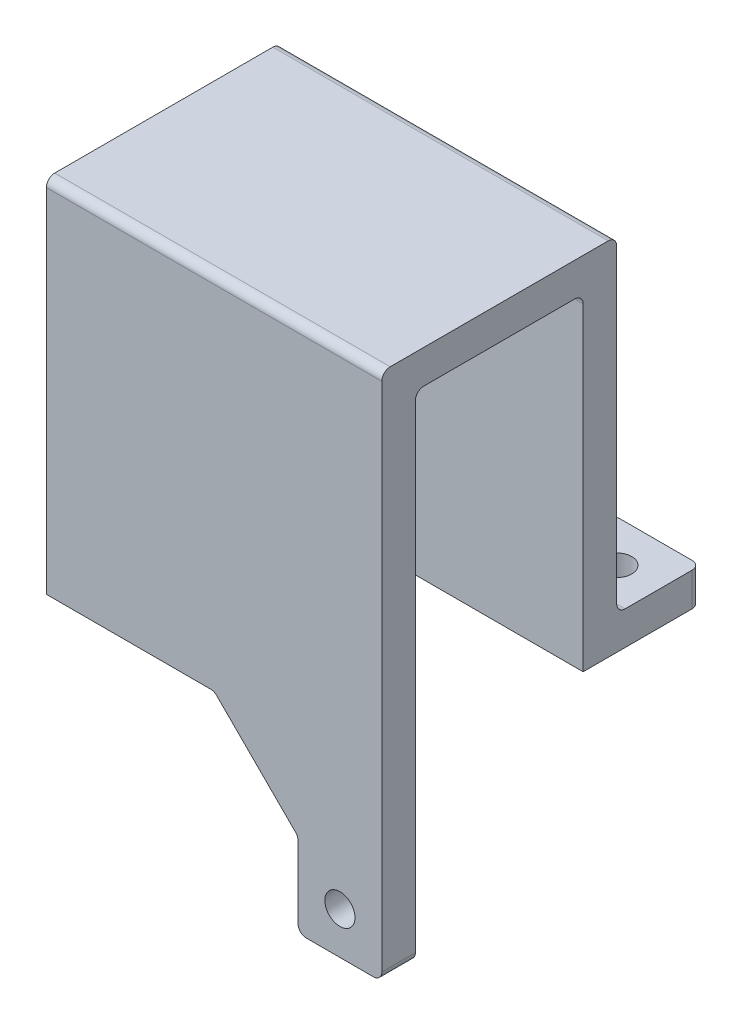
ISO-10303-21;
HEADER;
FILE_DESCRIPTION(('STEP AP214'),'2;1');
FILE_NAME('part.step','',(''),(''),'','','');
FILE_SCHEMA(('AUTOMOTIVE_DESIGN { 1 0 10303 214 1 1 1 1 }'));
ENDSEC;
DATA;
#1=APPLICATION_CONTEXT('core data for automotive mechanical design processes');
#2=APPLICATION_PROTOCOL_DEFINITION('international standard','automotive_design',2000,#1);
#3=PRODUCT_CONTEXT('',#1,'mechanical');
#4=PRODUCT('Part','Part','',(#3));
#5=PRODUCT_RELATED_PRODUCT_CATEGORY('part','',(#4));
#6=PRODUCT_DEFINITION_FORMATION('','',#4);
#7=PRODUCT_DEFINITION_CONTEXT('part definition',#1,'design');
#8=PRODUCT_DEFINITION('design','',#6,#7);
#9=PRODUCT_DEFINITION_SHAPE('','',#8);
#10=(LENGTH_UNIT() NAMED_UNIT(*) SI_UNIT(.MILLI.,.METRE.));
#11=(NAMED_UNIT(*) PLANE_ANGLE_UNIT() SI_UNIT($,.RADIAN.));
#12=(NAMED_UNIT(*) SI_UNIT($,.STERADIAN.) SOLID_ANGLE_UNIT());
#13=UNCERTAINTY_MEASURE_WITH_UNIT(LENGTH_MEASURE(1.E-05),#10,'distance_accuracy_value','');
#14=(GEOMETRIC_REPRESENTATION_CONTEXT(3) GLOBAL_UNCERTAINTY_ASSIGNED_CONTEXT((#13)) GLOBAL_UNIT_ASSIGNED_CONTEXT((#10,
#11,#12)) REPRESENTATION_CONTEXT('',''));
#15=CARTESIAN_POINT('',(0.,0.,0.));
#16=DIRECTION('',(0.,0.,1.));
#17=DIRECTION('',(1.,0.,0.));
#18=AXIS2_PLACEMENT_3D('',#15,#16,#17);
#19=CARTESIAN_POINT('',(0.,0.,0.));
#20=DIRECTION('',(0.,0.,1.));
#21=DIRECTION('',(1.,0.,0.));
#22=AXIS2_PLACEMENT_3D('',#19,#20,#21);
#23=PLANE('',#22);
#24=CARTESIAN_POINT('',(15.,-36.5,0.));
#25=DIRECTION('',(0.,0.,1.));
#26=DIRECTION('',(1.,0.,0.));
#27=AXIS2_PLACEMENT_3D('',#24,#25,#26);
#28=CIRCLE('',#27,1.80000000000001);
#29=CARTESIAN_POINT('',(16.8,-36.5,0.));
#30=VERTEX_POINT('',#29);
#31=EDGE_CURVE('E264',#30,#30,#28,.T.);
#32=ORIENTED_EDGE('',*,*,#31,.T.);
#33=EDGE_LOOP('',(#32));
#34=FACE_BOUND('',#33,.T.);
#35=DIRECTION('',(0.,1.,0.));
#36=VECTOR('',#35,1.);
#37=CARTESIAN_POINT('',(20.,0.,0.));
#38=LINE('',#37,#36);
#39=CARTESIAN_POINT('',(20.,-40.5,0.));
#40=VERTEX_POINT('',#39);
#41=CARTESIAN_POINT('',(20.,16.5,0.));
#42=VERTEX_POINT('',#41);
#43=EDGE_CURVE('E287',#40,#42,#38,.T.);
#44=ORIENTED_EDGE('',*,*,#43,.F.);
#45=CARTESIAN_POINT('',(19.,-40.5,0.));
#46=DIRECTION('',(0.,0.,1.));
#47=DIRECTION('',(1.,0.,0.));
#48=AXIS2_PLACEMENT_3D('',#45,#46,#47);
#49=CIRCLE('',#48,1.);
#50=CARTESIAN_POINT('',(19.,-41.5,0.));
#51=VERTEX_POINT('',#50);
#52=EDGE_CURVE('E344',#40,#51,#49,.F.);
#53=ORIENTED_EDGE('',*,*,#52,.T.);
#54=DIRECTION('',(-1.,0.,0.));
#55=VECTOR('',#54,1.);
#56=CARTESIAN_POINT('',(0.,-41.5,0.));
#57=LINE('',#56,#55);
#58=CARTESIAN_POINT('',(11.,-41.5,0.));
#59=VERTEX_POINT('',#58);
#60=EDGE_CURVE('E284',#51,#59,#57,.T.);
#61=ORIENTED_EDGE('',*,*,#60,.T.);
#62=CARTESIAN_POINT('',(11.,-40.5,0.));
#63=DIRECTION('',(0.,0.,1.));
#64=DIRECTION('',(1.,0.,0.));
#65=AXIS2_PLACEMENT_3D('',#62,#63,#64);
#66=CIRCLE('',#65,1.);
#67=CARTESIAN_POINT('',(10.,-40.5,0.));
#68=VERTEX_POINT('',#67);
#69=EDGE_CURVE('E342',#59,#68,#66,.F.);
#70=ORIENTED_EDGE('',*,*,#69,.T.);
#71=DIRECTION('',(0.,-1.,0.));
#72=VECTOR('',#71,1.);
#73=CARTESIAN_POINT('',(10.,0.,0.));
#74=LINE('',#73,#72);
#75=CARTESIAN_POINT('',(10.,-31.9142135623732,0.));
#76=VERTEX_POINT('',#75);
#77=EDGE_CURVE('E281',#76,#68,#74,.T.);
#78=ORIENTED_EDGE('',*,*,#77,.F.);
#79=CARTESIAN_POINT('',(9.00000000000001,-31.9142135623732,0.));
#80=DIRECTION('',(0.,0.,1.));
#81=DIRECTION('',(1.,0.,0.));
#82=AXIS2_PLACEMENT_3D('',#79,#80,#81);
#83=CIRCLE('',#82,1.);
#84=CARTESIAN_POINT('',(9.70710678118656,-31.2071067811866,0.));
#85=VERTEX_POINT('',#84);
#86=EDGE_CURVE('E390',#76,#85,#83,.T.);
#87=ORIENTED_EDGE('',*,*,#86,.T.);
#88=DIRECTION('',(0.707106781186545,-0.70710678118655,0.));
#89=VECTOR('',#88,1.);
#90=CARTESIAN_POINT('',(-10.75,-10.7499999999999,0.));
#91=LINE('',#90,#89);
#92=CARTESIAN_POINT('',(0.292893218813452,-21.7928932188135,0.));
#93=VERTEX_POINT('',#92);
#94=EDGE_CURVE('E301',#85,#93,#91,.F.);
#95=ORIENTED_EDGE('',*,*,#94,.T.);
#96=CARTESIAN_POINT('',(-0.414213562373096,-22.5,0.));
#97=DIRECTION('',(0.,0.,1.));
#98=DIRECTION('',(1.,0.,0.));
#99=AXIS2_PLACEMENT_3D('',#96,#97,#98);
#100=CIRCLE('',#99,1.);
#101=CARTESIAN_POINT('',(-0.414213562373096,-21.5,0.));
#102=VERTEX_POINT('',#101);
#103=EDGE_CURVE('E396',#93,#102,#100,.T.);
#104=ORIENTED_EDGE('',*,*,#103,.T.);
#105=DIRECTION('',(1.,0.,0.));
#106=VECTOR('',#105,1.);
#107=CARTESIAN_POINT('',(0.,-21.5,0.));
#108=LINE('',#107,#106);
#109=CARTESIAN_POINT('',(-20.,-21.5,0.));
#110=VERTEX_POINT('',#109);
#111=EDGE_CURVE('E259',#110,#102,#108,.T.);
#112=ORIENTED_EDGE('',*,*,#111,.F.);
#113=DIRECTION('',(0.,1.,0.));
#114=VECTOR('',#113,1.);
#115=CARTESIAN_POINT('',(-20.,0.,0.));
#116=LINE('',#115,#114);
#117=CARTESIAN_POINT('',(-20.,16.5,0.));
#118=VERTEX_POINT('',#117);
#119=EDGE_CURVE('E290',#110,#118,#116,.T.);
#120=ORIENTED_EDGE('',*,*,#119,.T.);
#121=DIRECTION('',(-1.,0.,0.));
#122=VECTOR('',#121,1.);
#123=CARTESIAN_POINT('',(20.,16.5,0.));
#124=LINE('',#123,#122);
#125=EDGE_CURVE('E340',#118,#42,#124,.F.);
#126=ORIENTED_EDGE('',*,*,#125,.T.);
#127=EDGE_LOOP('',(#44,#53,#61,#70,#78,#87,#95,#104,#112,#120,#126));
#128=FACE_BOUND('',#127,.T.);
#129=ADVANCED_FACE('F37',(#34,#128),#23,.F.);
#130=CARTESIAN_POINT('',(0.,-21.5,4.));
#131=DIRECTION('',(0.,1.,0.));
#132=DIRECTION('',(0.,0.,1.));
#133=AXIS2_PLACEMENT_3D('',#130,#131,#132);
#134=PLANE('',#133);
#135=ORIENTED_EDGE('',*,*,#111,.T.);
#136=DIRECTION('',(0.,0.,-1.));
#137=VECTOR('',#136,1.);
#138=CARTESIAN_POINT('',(-0.414213562373096,-21.5,4.));
#139=LINE('',#138,#137);
#140=CARTESIAN_POINT('',(-0.414213562373096,-21.5,4.));
#141=VERTEX_POINT('',#140);
#142=EDGE_CURVE('E360',#102,#141,#139,.F.);
#143=ORIENTED_EDGE('',*,*,#142,.T.);
#144=DIRECTION('',(1.,0.,0.));
#145=VECTOR('',#144,1.);
#146=CARTESIAN_POINT('',(0.,-21.5,4.));
#147=LINE('',#146,#145);
#148=CARTESIAN_POINT('',(-20.,-21.5,4.));
#149=VERTEX_POINT('',#148);
#150=EDGE_CURVE('E260',#149,#141,#147,.T.);
#151=ORIENTED_EDGE('',*,*,#150,.F.);
#152=DIRECTION('',(0.,0.,-1.));
#153=VECTOR('',#152,1.);
#154=CARTESIAN_POINT('',(-20.,-21.5,4.));
#155=LINE('',#154,#153);
#156=EDGE_CURVE('E278',#149,#110,#155,.T.);
#157=ORIENTED_EDGE('',*,*,#156,.T.);
#158=EDGE_LOOP('',(#135,#143,#151,#157));
#159=FACE_BOUND('',#158,.T.);
#160=ADVANCED_FACE('F443',(#159),#134,.F.);
#161=CARTESIAN_POINT('',(10.,0.,4.));
#162=DIRECTION('',(1.,0.,0.));
#163=DIRECTION('',(0.,1.,0.));
#164=AXIS2_PLACEMENT_3D('',#161,#162,#163);
#165=PLANE('',#164);
#166=ORIENTED_EDGE('',*,*,#77,.T.);
#167=DIRECTION('',(0.,0.,-1.));
#168=VECTOR('',#167,1.);
#169=CARTESIAN_POINT('',(10.,-40.5,4.));
#170=LINE('',#169,#168);
#171=CARTESIAN_POINT('',(10.,-40.5,4.));
#172=VERTEX_POINT('',#171);
#173=EDGE_CURVE('E354',#68,#172,#170,.F.);
#174=ORIENTED_EDGE('',*,*,#173,.T.);
#175=DIRECTION('',(0.,-1.,0.));
#176=VECTOR('',#175,1.);
#177=CARTESIAN_POINT('',(10.,0.,4.));
#178=LINE('',#177,#176);
#179=CARTESIAN_POINT('',(10.,-31.9142135623732,4.));
#180=VERTEX_POINT('',#179);
#181=EDGE_CURVE('E263',#180,#172,#178,.T.);
#182=ORIENTED_EDGE('',*,*,#181,.F.);
#183=DIRECTION('',(0.,0.,1.));
#184=VECTOR('',#183,1.);
#185=CARTESIAN_POINT('',(10.,-31.9142135623732,0.));
#186=LINE('',#185,#184);
#187=EDGE_CURVE('E351',#180,#76,#186,.F.);
#188=ORIENTED_EDGE('',*,*,#187,.T.);
#189=EDGE_LOOP('',(#166,#174,#182,#188));
#190=FACE_BOUND('',#189,.T.);
#191=ADVANCED_FACE('F449',(#190),#165,.F.);
#192=CARTESIAN_POINT('',(0.,-41.5,4.));
#193=DIRECTION('',(0.,-1.,0.));
#194=DIRECTION('',(1.,0.,0.));
#195=AXIS2_PLACEMENT_3D('',#192,#193,#194);
#196=PLANE('',#195);
#197=ORIENTED_EDGE('',*,*,#60,.F.);
#198=DIRECTION('',(0.,0.,-1.));
#199=VECTOR('',#198,1.);
#200=CARTESIAN_POINT('',(19.,-41.5,4.));
#201=LINE('',#200,#199);
#202=CARTESIAN_POINT('',(19.,-41.5,4.));
#203=VERTEX_POINT('',#202);
#204=EDGE_CURVE('E349',#51,#203,#201,.F.);
#205=ORIENTED_EDGE('',*,*,#204,.T.);
#206=DIRECTION('',(-1.,0.,0.));
#207=VECTOR('',#206,1.);
#208=CARTESIAN_POINT('',(0.,-41.5,4.));
#209=LINE('',#208,#207);
#210=CARTESIAN_POINT('',(11.,-41.5,4.));
#211=VERTEX_POINT('',#210);
#212=EDGE_CURVE('E267',#203,#211,#209,.T.);
#213=ORIENTED_EDGE('',*,*,#212,.T.);
#214=DIRECTION('',(0.,0.,-1.));
#215=VECTOR('',#214,1.);
#216=CARTESIAN_POINT('',(11.,-41.5,0.));
#217=LINE('',#216,#215);
#218=EDGE_CURVE('E346',#211,#59,#217,.T.);
#219=ORIENTED_EDGE('',*,*,#218,.T.);
#220=EDGE_LOOP('',(#197,#205,#213,#219));
#221=FACE_BOUND('',#220,.T.);
#222=ADVANCED_FACE('F466',(#221),#196,.T.);
#223=CARTESIAN_POINT('',(20.,0.,4.));
#224=DIRECTION('',(-1.,0.,0.));
#225=DIRECTION('',(0.,0.,1.));
#226=AXIS2_PLACEMENT_3D('',#223,#224,#225);
#227=PLANE('',#226);
#228=DIRECTION('',(0.,0.,-1.));
#229=VECTOR('',#228,1.);
#230=CARTESIAN_POINT('',(20.,21.5,4.));
#231=LINE('',#230,#229);
#232=CARTESIAN_POINT('',(20.,21.5,3.));
#233=VERTEX_POINT('',#232);
#234=CARTESIAN_POINT('',(20.,21.5,-23.));
#235=VERTEX_POINT('',#234);
#236=EDGE_CURVE('E298',#233,#235,#231,.T.);
#237=ORIENTED_EDGE('',*,*,#236,.F.);
#238=CARTESIAN_POINT('',(20.,20.5,3.));
#239=DIRECTION('',(-1.,0.,0.));
#240=DIRECTION('',(0.,0.,1.));
#241=AXIS2_PLACEMENT_3D('',#238,#239,#240);
#242=CIRCLE('',#241,1.);
#243=CARTESIAN_POINT('',(20.,20.5,4.));
#244=VERTEX_POINT('',#243);
#245=EDGE_CURVE('E324',#233,#244,#242,.F.);
#246=ORIENTED_EDGE('',*,*,#245,.T.);
#247=DIRECTION('',(0.,1.,0.));
#248=VECTOR('',#247,1.);
#249=CARTESIAN_POINT('',(20.,0.,4.));
#250=LINE('',#249,#248);
#251=CARTESIAN_POINT('',(20.,-40.5,4.));
#252=VERTEX_POINT('',#251);
#253=EDGE_CURVE('E270',#252,#244,#250,.T.);
#254=ORIENTED_EDGE('',*,*,#253,.F.);
#255=DIRECTION('',(0.,0.,-1.));
#256=VECTOR('',#255,1.);
#257=CARTESIAN_POINT('',(20.,-40.5,0.));
#258=LINE('',#257,#256);
#259=EDGE_CURVE('E319',#252,#40,#258,.T.);
#260=ORIENTED_EDGE('',*,*,#259,.T.);
#261=ORIENTED_EDGE('',*,*,#43,.T.);
#262=CARTESIAN_POINT('',(20.,16.5,-1.));
#263=DIRECTION('',(-1.,0.,0.));
#264=DIRECTION('',(0.,0.,1.));
#265=AXIS2_PLACEMENT_3D('',#262,#263,#264);
#266=CIRCLE('',#265,1.);
#267=CARTESIAN_POINT('',(20.,17.5,-1.));
#268=VERTEX_POINT('',#267);
#269=EDGE_CURVE('E11',#42,#268,#266,.T.);
#270=ORIENTED_EDGE('',*,*,#269,.T.);
#271=DIRECTION('',(0.,0.,1.));
#272=VECTOR('',#271,1.);
#273=CARTESIAN_POINT('',(20.,17.5,-20.));
#274=LINE('',#273,#272);
#275=CARTESIAN_POINT('',(20.,17.5,-19.));
#276=VERTEX_POINT('',#275);
#277=EDGE_CURVE('E256',#276,#268,#274,.T.);
#278=ORIENTED_EDGE('',*,*,#277,.F.);
#279=CARTESIAN_POINT('',(20.,16.5,-19.));
#280=DIRECTION('',(-1.,0.,0.));
#281=DIRECTION('',(0.,0.,1.));
#282=AXIS2_PLACEMENT_3D('',#279,#280,#281);
#283=CIRCLE('',#282,1.);
#284=CARTESIAN_POINT('',(20.,16.5,-20.));
#285=VERTEX_POINT('',#284);
#286=EDGE_CURVE('E405',#276,#285,#283,.T.);
#287=ORIENTED_EDGE('',*,*,#286,.T.);
#288=DIRECTION('',(0.,-1.,0.));
#289=VECTOR('',#288,1.);
#290=CARTESIAN_POINT('',(20.,-21.5,-20.));
#291=LINE('',#290,#289);
#292=CARTESIAN_POINT('',(20.,-21.5,-20.));
#293=VERTEX_POINT('',#292);
#294=EDGE_CURVE('E242',#285,#293,#291,.T.);
#295=ORIENTED_EDGE('',*,*,#294,.T.);
#296=DIRECTION('',(0.,0.,1.));
#297=VECTOR('',#296,1.);
#298=CARTESIAN_POINT('',(20.,-21.5,-24.));
#299=LINE('',#298,#297);
#300=CARTESIAN_POINT('',(20.,-21.5,-33.));
#301=VERTEX_POINT('',#300);
#302=EDGE_CURVE('E232',#301,#293,#299,.T.);
#303=ORIENTED_EDGE('',*,*,#302,.F.);
#304=DIRECTION('',(0.,-1.,0.));
#305=VECTOR('',#304,1.);
#306=CARTESIAN_POINT('',(20.,0.,-33.));
#307=LINE('',#306,#305);
#308=CARTESIAN_POINT('',(20.,-17.5,-33.));
#309=VERTEX_POINT('',#308);
#310=EDGE_CURVE('E317',#301,#309,#307,.F.);
#311=ORIENTED_EDGE('',*,*,#310,.T.);
#312=DIRECTION('',(0.,0.,1.));
#313=VECTOR('',#312,1.);
#314=CARTESIAN_POINT('',(20.,-17.5,-34.));
#315=LINE('',#314,#313);
#316=CARTESIAN_POINT('',(20.,-17.5,-25.));
#317=VERTEX_POINT('',#316);
#318=EDGE_CURVE('E245',#309,#317,#315,.T.);
#319=ORIENTED_EDGE('',*,*,#318,.T.);
#320=CARTESIAN_POINT('',(20.,-16.5,-25.));
#321=DIRECTION('',(-1.,0.,0.));
#322=DIRECTION('',(0.,0.,1.));
#323=AXIS2_PLACEMENT_3D('',#320,#321,#322);
#324=CIRCLE('',#323,1.);
#325=CARTESIAN_POINT('',(20.,-16.5,-24.));
#326=VERTEX_POINT('',#325);
#327=EDGE_CURVE('E400',#317,#326,#324,.T.);
#328=ORIENTED_EDGE('',*,*,#327,.T.);
#329=DIRECTION('',(0.,-1.,0.));
#330=VECTOR('',#329,1.);
#331=CARTESIAN_POINT('',(20.,-21.5,-24.));
#332=LINE('',#331,#330);
#333=CARTESIAN_POINT('',(20.,20.5,-24.));
#334=VERTEX_POINT('',#333);
#335=EDGE_CURVE('E222',#334,#326,#332,.T.);
#336=ORIENTED_EDGE('',*,*,#335,.F.);
#337=CARTESIAN_POINT('',(20.,20.5,-23.));
#338=DIRECTION('',(-1.,0.,0.));
#339=DIRECTION('',(0.,0.,1.));
#340=AXIS2_PLACEMENT_3D('',#337,#338,#339);
#341=CIRCLE('',#340,1.);
#342=EDGE_CURVE('E322',#334,#235,#341,.F.);
#343=ORIENTED_EDGE('',*,*,#342,.T.);
#344=EDGE_LOOP('',(#237,#246,#254,#260,#261,#270,#278,#287,#295,#303,#311,#319,#328,#336,#343));
#345=FACE_BOUND('',#344,.T.);
#346=ADVANCED_FACE('F419',(#345),#227,.F.);
#347=CARTESIAN_POINT('',(0.,21.5,4.));
#348=DIRECTION('',(0.,1.,0.));
#349=DIRECTION('',(0.,0.,1.));
#350=AXIS2_PLACEMENT_3D('',#347,#348,#349);
#351=PLANE('',#350);
#352=DIRECTION('',(0.,0.,-1.));
#353=VECTOR('',#352,1.);
#354=CARTESIAN_POINT('',(-20.,21.5,4.));
#355=LINE('',#354,#353);
#356=CARTESIAN_POINT('',(-20.,21.5,3.));
#357=VERTEX_POINT('',#356);
#358=CARTESIAN_POINT('',(-20.,21.5,-23.));
#359=VERTEX_POINT('',#358);
#360=EDGE_CURVE('E296',#357,#359,#355,.T.);
#361=ORIENTED_EDGE('',*,*,#360,.F.);
#362=DIRECTION('',(1.,0.,0.));
#363=VECTOR('',#362,1.);
#364=CARTESIAN_POINT('',(0.,21.5,3.));
#365=LINE('',#364,#363);
#366=EDGE_CURVE('E314',#357,#233,#365,.T.);
#367=ORIENTED_EDGE('',*,*,#366,.T.);
#368=ORIENTED_EDGE('',*,*,#236,.T.);
#369=DIRECTION('',(1.,0.,0.));
#370=VECTOR('',#369,1.);
#371=CARTESIAN_POINT('',(0.,21.5,-23.));
#372=LINE('',#371,#370);
#373=EDGE_CURVE('E312',#235,#359,#372,.F.);
#374=ORIENTED_EDGE('',*,*,#373,.T.);
#375=EDGE_LOOP('',(#361,#367,#368,#374));
#376=FACE_BOUND('',#375,.T.);
#377=ADVANCED_FACE('F460',(#376),#351,.T.);
#378=CARTESIAN_POINT('',(-20.,0.,4.));
#379=DIRECTION('',(-1.,0.,0.));
#380=DIRECTION('',(0.,0.,1.));
#381=AXIS2_PLACEMENT_3D('',#378,#379,#380);
#382=PLANE('',#381);
#383=DIRECTION('',(0.,1.,0.));
#384=VECTOR('',#383,1.);
#385=CARTESIAN_POINT('',(-20.,0.,4.));
#386=LINE('',#385,#384);
#387=CARTESIAN_POINT('',(-20.,20.5,4.));
#388=VERTEX_POINT('',#387);
#389=EDGE_CURVE('E273',#149,#388,#386,.T.);
#390=ORIENTED_EDGE('',*,*,#389,.T.);
#391=CARTESIAN_POINT('',(-20.,20.5,3.));
#392=DIRECTION('',(-1.,0.,0.));
#393=DIRECTION('',(0.,0.,1.));
#394=AXIS2_PLACEMENT_3D('',#391,#392,#393);
#395=CIRCLE('',#394,1.);
#396=EDGE_CURVE('E333',#388,#357,#395,.T.);
#397=ORIENTED_EDGE('',*,*,#396,.T.);
#398=ORIENTED_EDGE('',*,*,#360,.T.);
#399=CARTESIAN_POINT('',(-20.,20.5,-23.));
#400=DIRECTION('',(-1.,0.,0.));
#401=DIRECTION('',(0.,0.,1.));
#402=AXIS2_PLACEMENT_3D('',#399,#400,#401);
#403=CIRCLE('',#402,1.);
#404=CARTESIAN_POINT('',(-20.,20.5,-24.));
#405=VERTEX_POINT('',#404);
#406=EDGE_CURVE('E238',#359,#405,#403,.T.);
#407=ORIENTED_EDGE('',*,*,#406,.T.);
#408=DIRECTION('',(0.,1.,0.));
#409=VECTOR('',#408,1.);
#410=CARTESIAN_POINT('',(-20.,-21.5,-24.));
#411=LINE('',#410,#409);
#412=CARTESIAN_POINT('',(-20.,-21.5,-24.));
#413=VERTEX_POINT('',#412);
#414=EDGE_CURVE('E216',#413,#405,#411,.T.);
#415=ORIENTED_EDGE('',*,*,#414,.F.);
#416=DIRECTION('',(0.,0.,1.));
#417=VECTOR('',#416,1.);
#418=CARTESIAN_POINT('',(-20.,-21.5,-24.));
#419=LINE('',#418,#417);
#420=CARTESIAN_POINT('',(-20.,-21.5,-20.));
#421=VERTEX_POINT('',#420);
#422=EDGE_CURVE('E221',#413,#421,#419,.T.);
#423=ORIENTED_EDGE('',*,*,#422,.T.);
#424=DIRECTION('',(0.,1.,0.));
#425=VECTOR('',#424,1.);
#426=CARTESIAN_POINT('',(-20.,-21.5,-20.));
#427=LINE('',#426,#425);
#428=CARTESIAN_POINT('',(-20.,16.5,-20.));
#429=VERTEX_POINT('',#428);
#430=EDGE_CURVE('E248',#421,#429,#427,.T.);
#431=ORIENTED_EDGE('',*,*,#430,.T.);
#432=CARTESIAN_POINT('',(-20.,16.5,-19.));
#433=DIRECTION('',(-1.,0.,0.));
#434=DIRECTION('',(0.,0.,1.));
#435=AXIS2_PLACEMENT_3D('',#432,#433,#434);
#436=CIRCLE('',#435,1.);
#437=CARTESIAN_POINT('',(-20.,17.5,-19.));
#438=VERTEX_POINT('',#437);
#439=EDGE_CURVE('E403',#429,#438,#436,.F.);
#440=ORIENTED_EDGE('',*,*,#439,.T.);
#441=DIRECTION('',(0.,0.,1.));
#442=VECTOR('',#441,1.);
#443=CARTESIAN_POINT('',(-20.,17.5,-20.));
#444=LINE('',#443,#442);
#445=CARTESIAN_POINT('',(-20.,17.5,-1.));
#446=VERTEX_POINT('',#445);
#447=EDGE_CURVE('E253',#438,#446,#444,.T.);
#448=ORIENTED_EDGE('',*,*,#447,.T.);
#449=CARTESIAN_POINT('',(-20.,16.5,-1.));
#450=DIRECTION('',(-1.,0.,0.));
#451=DIRECTION('',(0.,0.,1.));
#452=AXIS2_PLACEMENT_3D('',#449,#450,#451);
#453=CIRCLE('',#452,1.);
#454=EDGE_CURVE('E46',#446,#118,#453,.F.);
#455=ORIENTED_EDGE('',*,*,#454,.T.);
#456=ORIENTED_EDGE('',*,*,#119,.F.);
#457=ORIENTED_EDGE('',*,*,#156,.F.);
#458=EDGE_LOOP('',(#390,#397,#398,#407,#415,#423,#431,#440,#448,#455,#456,#457));
#459=FACE_BOUND('',#458,.T.);
#460=ADVANCED_FACE('F235',(#459),#382,.T.);
#461=CARTESIAN_POINT('',(15.,-36.5,4.));
#462=DIRECTION('',(0.,0.,-1.));
#463=DIRECTION('',(-1.,0.,0.));
#464=AXIS2_PLACEMENT_3D('',#461,#462,#463);
#465=CYLINDRICAL_SURFACE('',#464,1.80000000000001);
#466=CARTESIAN_POINT('',(15.,-36.5,4.));
#467=DIRECTION('',(0.,0.,1.));
#468=DIRECTION('',(1.,0.,0.));
#469=AXIS2_PLACEMENT_3D('',#466,#467,#468);
#470=CIRCLE('',#469,1.80000000000001);
#471=CARTESIAN_POINT('',(16.8,-36.5,4.));
#472=VERTEX_POINT('',#471);
#473=EDGE_CURVE('E275',#472,#472,#470,.T.);
#474=ORIENTED_EDGE('',*,*,#473,.T.);
#475=EDGE_LOOP('',(#474));
#476=FACE_BOUND('',#475,.T.);
#477=ORIENTED_EDGE('',*,*,#31,.F.);
#478=EDGE_LOOP('',(#477));
#479=FACE_BOUND('',#478,.T.);
#480=ADVANCED_FACE('F454',(#476,#479),#465,.F.);
#481=CARTESIAN_POINT('',(0.,0.,4.));
#482=DIRECTION('',(0.,0.,1.));
#483=DIRECTION('',(1.,0.,0.));
#484=AXIS2_PLACEMENT_3D('',#481,#482,#483);
#485=PLANE('',#484);
#486=ORIENTED_EDGE('',*,*,#253,.T.);
#487=DIRECTION('',(1.,0.,0.));
#488=VECTOR('',#487,1.);
#489=CARTESIAN_POINT('',(0.,20.5,4.));
#490=LINE('',#489,#488);
#491=EDGE_CURVE('E330',#244,#388,#490,.F.);
#492=ORIENTED_EDGE('',*,*,#491,.T.);
#493=ORIENTED_EDGE('',*,*,#389,.F.);
#494=ORIENTED_EDGE('',*,*,#150,.T.);
#495=CARTESIAN_POINT('',(-0.414213562373096,-22.5,4.));
#496=DIRECTION('',(0.,0.,1.));
#497=DIRECTION('',(1.,0.,0.));
#498=AXIS2_PLACEMENT_3D('',#495,#496,#497);
#499=CIRCLE('',#498,1.);
#500=CARTESIAN_POINT('',(0.292893218813456,-21.7928932188135,4.));
#501=VERTEX_POINT('',#500);
#502=EDGE_CURVE('E394',#141,#501,#499,.F.);
#503=ORIENTED_EDGE('',*,*,#502,.T.);
#504=DIRECTION('',(-0.707106781186545,0.70710678118655,0.));
#505=VECTOR('',#504,1.);
#506=CARTESIAN_POINT('',(10.,-31.5000000000001,4.));
#507=LINE('',#506,#505);
#508=CARTESIAN_POINT('',(9.70710678118656,-31.2071067811866,4.));
#509=VERTEX_POINT('',#508);
#510=EDGE_CURVE('E304',#501,#509,#507,.F.);
#511=ORIENTED_EDGE('',*,*,#510,.T.);
#512=CARTESIAN_POINT('',(9.00000000000001,-31.9142135623732,4.));
#513=DIRECTION('',(0.,0.,1.));
#514=DIRECTION('',(1.,0.,0.));
#515=AXIS2_PLACEMENT_3D('',#512,#513,#514);
#516=CIRCLE('',#515,1.);
#517=EDGE_CURVE('E392',#509,#180,#516,.F.);
#518=ORIENTED_EDGE('',*,*,#517,.T.);
#519=ORIENTED_EDGE('',*,*,#181,.T.);
#520=CARTESIAN_POINT('',(11.,-40.5,4.));
#521=DIRECTION('',(0.,0.,1.));
#522=DIRECTION('',(1.,0.,0.));
#523=AXIS2_PLACEMENT_3D('',#520,#521,#522);
#524=CIRCLE('',#523,1.);
#525=EDGE_CURVE('E326',#172,#211,#524,.T.);
#526=ORIENTED_EDGE('',*,*,#525,.T.);
#527=ORIENTED_EDGE('',*,*,#212,.F.);
#528=CARTESIAN_POINT('',(19.,-40.5,4.));
#529=DIRECTION('',(0.,0.,1.));
#530=DIRECTION('',(1.,0.,0.));
#531=AXIS2_PLACEMENT_3D('',#528,#529,#530);
#532=CIRCLE('',#531,1.);
#533=EDGE_CURVE('E328',#203,#252,#532,.T.);
#534=ORIENTED_EDGE('',*,*,#533,.T.);
#535=EDGE_LOOP('',(#486,#492,#493,#494,#503,#511,#518,#519,#526,#527,#534));
#536=FACE_BOUND('',#535,.T.);
#537=ORIENTED_EDGE('',*,*,#473,.F.);
#538=EDGE_LOOP('',(#537));
#539=FACE_BOUND('',#538,.T.);
#540=ADVANCED_FACE('F439',(#536,#539),#485,.T.);
#541=CARTESIAN_POINT('',(20.,17.5,-20.));
#542=DIRECTION('',(0.,1.,0.));
#543=DIRECTION('',(-1.,0.,0.));
#544=AXIS2_PLACEMENT_3D('',#541,#542,#543);
#545=PLANE('',#544);
#546=ORIENTED_EDGE('',*,*,#447,.F.);
#547=DIRECTION('',(-1.,0.,0.));
#548=VECTOR('',#547,1.);
#549=CARTESIAN_POINT('',(20.,17.5,-19.));
#550=LINE('',#549,#548);
#551=EDGE_CURVE('E388',#438,#276,#550,.F.);
#552=ORIENTED_EDGE('',*,*,#551,.T.);
#553=ORIENTED_EDGE('',*,*,#277,.T.);
#554=DIRECTION('',(-1.,0.,0.));
#555=VECTOR('',#554,1.);
#556=CARTESIAN_POINT('',(-20.,17.5,-1.));
#557=LINE('',#556,#555);
#558=EDGE_CURVE('E385',#268,#446,#557,.T.);
#559=ORIENTED_EDGE('',*,*,#558,.T.);
#560=EDGE_LOOP('',(#546,#552,#553,#559));
#561=FACE_BOUND('',#560,.T.);
#562=ADVANCED_FACE('F422',(#561),#545,.F.);
#563=CARTESIAN_POINT('',(0.,0.,-20.));
#564=DIRECTION('',(0.,0.,-1.));
#565=DIRECTION('',(-1.,0.,0.));
#566=AXIS2_PLACEMENT_3D('',#563,#564,#565);
#567=PLANE('',#566);
#568=ORIENTED_EDGE('',*,*,#294,.F.);
#569=DIRECTION('',(-1.,0.,0.));
#570=VECTOR('',#569,1.);
#571=CARTESIAN_POINT('',(-20.,16.5,-20.));
#572=LINE('',#571,#570);
#573=EDGE_CURVE('E382',#285,#429,#572,.T.);
#574=ORIENTED_EDGE('',*,*,#573,.T.);
#575=ORIENTED_EDGE('',*,*,#430,.F.);
#576=DIRECTION('',(-1.,0.,0.));
#577=VECTOR('',#576,1.);
#578=CARTESIAN_POINT('',(-20.,-21.5,-20.));
#579=LINE('',#578,#577);
#580=EDGE_CURVE('E228',#293,#421,#579,.T.);
#581=ORIENTED_EDGE('',*,*,#580,.F.);
#582=EDGE_LOOP('',(#568,#574,#575,#581));
#583=FACE_BOUND('',#582,.T.);
#584=ADVANCED_FACE('F430',(#583),#567,.F.);
#585=CARTESIAN_POINT('',(-20.,-21.5,-24.));
#586=DIRECTION('',(0.,1.,0.));
#587=DIRECTION('',(-1.,0.,0.));
#588=AXIS2_PLACEMENT_3D('',#585,#586,#587);
#589=PLANE('',#588);
#590=CARTESIAN_POINT('',(15.,-21.5,-29.));
#591=DIRECTION('',(0.,1.,0.));
#592=DIRECTION('',(-1.,0.,0.));
#593=AXIS2_PLACEMENT_3D('',#590,#591,#592);
#594=CIRCLE('',#593,1.8);
#595=CARTESIAN_POINT('',(13.2,-21.5,-29.));
#596=VERTEX_POINT('',#595);
#597=EDGE_CURVE('E754',#596,#596,#594,.T.);
#598=ORIENTED_EDGE('',*,*,#597,.T.);
#599=EDGE_LOOP('',(#598));
#600=FACE_BOUND('',#599,.T.);
#601=DIRECTION('',(-1.,0.,0.));
#602=VECTOR('',#601,1.);
#603=CARTESIAN_POINT('',(20.,-21.5,-34.));
#604=LINE('',#603,#602);
#605=CARTESIAN_POINT('',(19.,-21.5,-34.));
#606=VERTEX_POINT('',#605);
#607=CARTESIAN_POINT('',(10.4142135623731,-21.5,-34.));
#608=VERTEX_POINT('',#607);
#609=EDGE_CURVE('E755',#606,#608,#604,.T.);
#610=ORIENTED_EDGE('',*,*,#609,.F.);
#611=CARTESIAN_POINT('',(19.,-21.5,-33.));
#612=DIRECTION('',(0.,1.,0.));
#613=DIRECTION('',(-1.,0.,0.));
#614=AXIS2_PLACEMENT_3D('',#611,#612,#613);
#615=CIRCLE('',#614,1.);
#616=EDGE_CURVE('E371',#606,#301,#615,.F.);
#617=ORIENTED_EDGE('',*,*,#616,.T.);
#618=ORIENTED_EDGE('',*,*,#302,.T.);
#619=ORIENTED_EDGE('',*,*,#580,.T.);
#620=ORIENTED_EDGE('',*,*,#422,.F.);
#621=DIRECTION('',(-1.,0.,0.));
#622=VECTOR('',#621,1.);
#623=CARTESIAN_POINT('',(-20.,-21.5,-24.));
#624=LINE('',#623,#622);
#625=CARTESIAN_POINT('',(-0.414213562373089,-21.5,-24.));
#626=VERTEX_POINT('',#625);
#627=EDGE_CURVE('E211',#626,#413,#624,.T.);
#628=ORIENTED_EDGE('',*,*,#627,.F.);
#629=CARTESIAN_POINT('',(-0.41421356237309,-21.5,-25.));
#630=DIRECTION('',(0.,1.,0.));
#631=DIRECTION('',(-1.,0.,0.));
#632=AXIS2_PLACEMENT_3D('',#629,#630,#631);
#633=CIRCLE('',#632,1.);
#634=CARTESIAN_POINT('',(0.292893218813458,-21.5,-24.2928932188135));
#635=VERTEX_POINT('',#634);
#636=EDGE_CURVE('E398',#626,#635,#633,.T.);
#637=ORIENTED_EDGE('',*,*,#636,.T.);
#638=DIRECTION('',(0.707106781186548,0.,-0.707106781186547));
#639=VECTOR('',#638,1.);
#640=CARTESIAN_POINT('',(-10.,-21.5,-14.));
#641=LINE('',#640,#639);
#642=CARTESIAN_POINT('',(9.70710678118655,-21.5,-33.7071067811865));
#643=VERTEX_POINT('',#642);
#644=EDGE_CURVE('E309',#635,#643,#641,.T.);
#645=ORIENTED_EDGE('',*,*,#644,.T.);
#646=CARTESIAN_POINT('',(10.4142135623731,-21.5,-33.));
#647=DIRECTION('',(0.,1.,0.));
#648=DIRECTION('',(-1.,0.,0.));
#649=AXIS2_PLACEMENT_3D('',#646,#647,#648);
#650=CIRCLE('',#649,1.);
#651=EDGE_CURVE('E369',#643,#608,#650,.F.);
#652=ORIENTED_EDGE('',*,*,#651,.T.);
#653=EDGE_LOOP('',(#610,#617,#618,#619,#620,#628,#637,#645,#652));
#654=FACE_BOUND('',#653,.T.);
#655=ADVANCED_FACE('F226',(#600,#654),#589,.F.);
#656=CARTESIAN_POINT('',(0.,0.,-24.));
#657=DIRECTION('',(0.,0.,-1.));
#658=DIRECTION('',(-1.,0.,0.));
#659=AXIS2_PLACEMENT_3D('',#656,#657,#658);
#660=PLANE('',#659);
#661=ORIENTED_EDGE('',*,*,#414,.T.);
#662=DIRECTION('',(1.,0.,0.));
#663=VECTOR('',#662,1.);
#664=CARTESIAN_POINT('',(0.,20.5,-24.));
#665=LINE('',#664,#663);
#666=EDGE_CURVE('E338',#405,#334,#665,.T.);
#667=ORIENTED_EDGE('',*,*,#666,.T.);
#668=ORIENTED_EDGE('',*,*,#335,.T.);
#669=DIRECTION('',(1.,0.,0.));
#670=VECTOR('',#669,1.);
#671=CARTESIAN_POINT('',(0.,-16.5,-24.));
#672=LINE('',#671,#670);
#673=CARTESIAN_POINT('',(-0.41421356237309,-16.5,-24.));
#674=VERTEX_POINT('',#673);
#675=EDGE_CURVE('E335',#326,#674,#672,.F.);
#676=ORIENTED_EDGE('',*,*,#675,.T.);
#677=DIRECTION('',(0.,-1.,0.));
#678=VECTOR('',#677,1.);
#679=CARTESIAN_POINT('',(-0.41421356237309,0.,-24.));
#680=LINE('',#679,#678);
#681=EDGE_CURVE('E219',#674,#626,#680,.T.);
#682=ORIENTED_EDGE('',*,*,#681,.T.);
#683=ORIENTED_EDGE('',*,*,#627,.T.);
#684=EDGE_LOOP('',(#661,#667,#668,#676,#682,#683));
#685=FACE_BOUND('',#684,.T.);
#686=ADVANCED_FACE('F213',(#685),#660,.T.);
#687=CARTESIAN_POINT('',(20.,-17.5,-34.));
#688=DIRECTION('',(0.,-1.,0.));
#689=DIRECTION('',(0.,0.,-1.));
#690=AXIS2_PLACEMENT_3D('',#687,#688,#689);
#691=PLANE('',#690);
#692=CARTESIAN_POINT('',(15.,-17.5,-29.));
#693=DIRECTION('',(0.,1.,0.));
#694=DIRECTION('',(0.,0.,1.));
#695=AXIS2_PLACEMENT_3D('',#692,#693,#694);
#696=CIRCLE('',#695,1.8);
#697=CARTESIAN_POINT('',(15.,-17.5,-27.2));
#698=VERTEX_POINT('',#697);
#699=EDGE_CURVE('E751',#698,#698,#696,.T.);
#700=ORIENTED_EDGE('',*,*,#699,.F.);
#701=EDGE_LOOP('',(#700));
#702=FACE_BOUND('',#701,.T.);
#703=ORIENTED_EDGE('',*,*,#318,.F.);
#704=CARTESIAN_POINT('',(19.,-17.5,-33.));
#705=DIRECTION('',(0.,-1.,0.));
#706=DIRECTION('',(0.,0.,-1.));
#707=AXIS2_PLACEMENT_3D('',#704,#705,#706);
#708=CIRCLE('',#707,1.);
#709=CARTESIAN_POINT('',(19.,-17.5,-34.));
#710=VERTEX_POINT('',#709);
#711=EDGE_CURVE('E377',#309,#710,#708,.F.);
#712=ORIENTED_EDGE('',*,*,#711,.T.);
#713=DIRECTION('',(1.,0.,0.));
#714=VECTOR('',#713,1.);
#715=CARTESIAN_POINT('',(20.,-17.5,-34.));
#716=LINE('',#715,#714);
#717=CARTESIAN_POINT('',(10.4142135623731,-17.5,-34.));
#718=VERTEX_POINT('',#717);
#719=EDGE_CURVE('E758',#718,#710,#716,.T.);
#720=ORIENTED_EDGE('',*,*,#719,.F.);
#721=CARTESIAN_POINT('',(10.4142135623731,-17.5,-33.));
#722=DIRECTION('',(0.,-1.,0.));
#723=DIRECTION('',(0.,0.,-1.));
#724=AXIS2_PLACEMENT_3D('',#721,#722,#723);
#725=CIRCLE('',#724,1.);
#726=CARTESIAN_POINT('',(9.70710678118655,-17.5,-33.7071067811865));
#727=VERTEX_POINT('',#726);
#728=EDGE_CURVE('E375',#718,#727,#725,.F.);
#729=ORIENTED_EDGE('',*,*,#728,.T.);
#730=DIRECTION('',(-0.707106781186548,0.,0.707106781186547));
#731=VECTOR('',#730,1.);
#732=CARTESIAN_POINT('',(15.,-17.5,-39.));
#733=LINE('',#732,#731);
#734=CARTESIAN_POINT('',(0.999999999999992,-17.5,-25.));
#735=VERTEX_POINT('',#734);
#736=EDGE_CURVE('E307',#727,#735,#733,.T.);
#737=ORIENTED_EDGE('',*,*,#736,.T.);
#738=DIRECTION('',(1.,0.,0.));
#739=VECTOR('',#738,1.);
#740=CARTESIAN_POINT('',(20.,-17.5,-25.));
#741=LINE('',#740,#739);
#742=EDGE_CURVE('E373',#735,#317,#741,.T.);
#743=ORIENTED_EDGE('',*,*,#742,.T.);
#744=EDGE_LOOP('',(#703,#712,#720,#729,#737,#743));
#745=FACE_BOUND('',#744,.T.);
#746=ADVANCED_FACE('F620',(#702,#745),#691,.F.);
#747=CARTESIAN_POINT('',(0.,0.,-34.));
#748=DIRECTION('',(0.,0.,1.));
#749=DIRECTION('',(1.,0.,0.));
#750=AXIS2_PLACEMENT_3D('',#747,#748,#749);
#751=PLANE('',#750);
#752=ORIENTED_EDGE('',*,*,#719,.T.);
#753=DIRECTION('',(0.,-1.,0.));
#754=VECTOR('',#753,1.);
#755=CARTESIAN_POINT('',(19.,0.,-34.));
#756=LINE('',#755,#754);
#757=EDGE_CURVE('E366',#710,#606,#756,.T.);
#758=ORIENTED_EDGE('',*,*,#757,.T.);
#759=ORIENTED_EDGE('',*,*,#609,.T.);
#760=DIRECTION('',(0.,1.,0.));
#761=VECTOR('',#760,1.);
#762=CARTESIAN_POINT('',(10.4142135623731,0.,-34.));
#763=LINE('',#762,#761);
#764=EDGE_CURVE('E363',#608,#718,#763,.T.);
#765=ORIENTED_EDGE('',*,*,#764,.T.);
#766=EDGE_LOOP('',(#752,#758,#759,#765));
#767=FACE_BOUND('',#766,.T.);
#768=ADVANCED_FACE('F615',(#767),#751,.F.);
#769=CARTESIAN_POINT('',(15.,-27.5,-29.));
#770=DIRECTION('',(0.,1.,0.));
#771=DIRECTION('',(0.,0.,1.));
#772=AXIS2_PLACEMENT_3D('',#769,#770,#771);
#773=CYLINDRICAL_SURFACE('',#772,1.8);
#774=ORIENTED_EDGE('',*,*,#699,.T.);
#775=EDGE_LOOP('',(#774));
#776=FACE_BOUND('',#775,.T.);
#777=ORIENTED_EDGE('',*,*,#597,.F.);
#778=EDGE_LOOP('',(#777));
#779=FACE_BOUND('',#778,.T.);
#780=ADVANCED_FACE('F481',(#776,#779),#773,.F.);
#781=CARTESIAN_POINT('',(10.,-31.5000000000001,4.));
#782=DIRECTION('',(-0.70710678118655,-0.707106781186545,0.));
#783=DIRECTION('',(0.,0.,1.));
#784=AXIS2_PLACEMENT_3D('',#781,#782,#783);
#785=PLANE('',#784);
#786=ORIENTED_EDGE('',*,*,#94,.F.);
#787=DIRECTION('',(0.,0.,-1.));
#788=VECTOR('',#787,1.);
#789=CARTESIAN_POINT('',(9.70710678118656,-31.2071067811866,4.));
#790=LINE('',#789,#788);
#791=EDGE_CURVE('E358',#85,#509,#790,.F.);
#792=ORIENTED_EDGE('',*,*,#791,.T.);
#793=ORIENTED_EDGE('',*,*,#510,.F.);
#794=DIRECTION('',(0.,0.,1.));
#795=VECTOR('',#794,1.);
#796=CARTESIAN_POINT('',(0.292893218813454,-21.7928932188135,0.));
#797=LINE('',#796,#795);
#798=EDGE_CURVE('E356',#501,#93,#797,.F.);
#799=ORIENTED_EDGE('',*,*,#798,.T.);
#800=EDGE_LOOP('',(#786,#792,#793,#799));
#801=FACE_BOUND('',#800,.T.);
#802=ADVANCED_FACE('F474',(#801),#785,.T.);
#803=CARTESIAN_POINT('',(10.,-21.5,-34.));
#804=DIRECTION('',(0.707106781186548,0.,0.707106781186548));
#805=DIRECTION('',(0.,1.,0.));
#806=AXIS2_PLACEMENT_3D('',#803,#804,#805);
#807=PLANE('',#806);
#808=ORIENTED_EDGE('',*,*,#736,.F.);
#809=DIRECTION('',(0.,1.,0.));
#810=VECTOR('',#809,1.);
#811=CARTESIAN_POINT('',(9.70710678118655,-21.5,-33.7071067811865));
#812=LINE('',#811,#810);
#813=EDGE_CURVE('E380',#727,#643,#812,.F.);
#814=ORIENTED_EDGE('',*,*,#813,.T.);
#815=ORIENTED_EDGE('',*,*,#644,.F.);
#816=DIRECTION('',(0.,-1.,0.));
#817=VECTOR('',#816,1.);
#818=CARTESIAN_POINT('',(0.292893218813454,-21.5,-24.2928932188135));
#819=LINE('',#818,#817);
#820=CARTESIAN_POINT('',(0.292893218813456,-17.2071067811865,-24.2928932188135));
#821=VERTEX_POINT('',#820);
#822=EDGE_CURVE('E53',#635,#821,#819,.F.);
#823=ORIENTED_EDGE('',*,*,#822,.T.);
#824=CARTESIAN_POINT('',(0.999999999999997,-16.5,-25.));
#825=DIRECTION('',(0.707106781186548,0.,0.707106781186548));
#826=DIRECTION('',(0.707106781186548,0.,-0.707106781186547));
#827=AXIS2_PLACEMENT_3D('',#824,#825,#826);
#828=ELLIPSE('',#827,1.41421356237309,1.);
#829=EDGE_CURVE('E57',#821,#735,#828,.T.);
#830=ORIENTED_EDGE('',*,*,#829,.T.);
#831=EDGE_LOOP('',(#808,#814,#815,#823,#830));
#832=FACE_BOUND('',#831,.T.);
#833=ADVANCED_FACE('F480',(#832),#807,.F.);
#834=CARTESIAN_POINT('',(0.,20.5,3.));
#835=DIRECTION('',(1.,0.,0.));
#836=DIRECTION('',(0.,0.,-1.));
#837=AXIS2_PLACEMENT_3D('',#834,#835,#836);
#838=CYLINDRICAL_SURFACE('',#837,1.);
#839=ORIENTED_EDGE('',*,*,#396,.F.);
#840=ORIENTED_EDGE('',*,*,#491,.F.);
#841=ORIENTED_EDGE('',*,*,#245,.F.);
#842=ORIENTED_EDGE('',*,*,#366,.F.);
#843=EDGE_LOOP('',(#839,#840,#841,#842));
#844=FACE_BOUND('',#843,.T.);
#845=ADVANCED_FACE('F487',(#844),#838,.T.);
#846=CARTESIAN_POINT('',(0.,20.5,-23.));
#847=DIRECTION('',(1.,0.,0.));
#848=DIRECTION('',(0.,0.,-1.));
#849=AXIS2_PLACEMENT_3D('',#846,#847,#848);
#850=CYLINDRICAL_SURFACE('',#849,1.);
#851=ORIENTED_EDGE('',*,*,#406,.F.);
#852=ORIENTED_EDGE('',*,*,#373,.F.);
#853=ORIENTED_EDGE('',*,*,#342,.F.);
#854=ORIENTED_EDGE('',*,*,#666,.F.);
#855=EDGE_LOOP('',(#851,#852,#853,#854));
#856=FACE_BOUND('',#855,.T.);
#857=ADVANCED_FACE('F490',(#856),#850,.T.);
#858=CARTESIAN_POINT('',(19.,-40.5,4.));
#859=DIRECTION('',(0.,0.,1.));
#860=DIRECTION('',(1.,0.,0.));
#861=AXIS2_PLACEMENT_3D('',#858,#859,#860);
#862=CYLINDRICAL_SURFACE('',#861,1.);
#863=ORIENTED_EDGE('',*,*,#533,.F.);
#864=ORIENTED_EDGE('',*,*,#204,.F.);
#865=ORIENTED_EDGE('',*,*,#52,.F.);
#866=ORIENTED_EDGE('',*,*,#259,.F.);
#867=EDGE_LOOP('',(#863,#864,#865,#866));
#868=FACE_BOUND('',#867,.T.);
#869=ADVANCED_FACE('F494',(#868),#862,.T.);
#870=CARTESIAN_POINT('',(11.,-40.5,4.));
#871=DIRECTION('',(0.,0.,1.));
#872=DIRECTION('',(1.,0.,0.));
#873=AXIS2_PLACEMENT_3D('',#870,#871,#872);
#874=CYLINDRICAL_SURFACE('',#873,1.);
#875=ORIENTED_EDGE('',*,*,#525,.F.);
#876=ORIENTED_EDGE('',*,*,#173,.F.);
#877=ORIENTED_EDGE('',*,*,#69,.F.);
#878=ORIENTED_EDGE('',*,*,#218,.F.);
#879=EDGE_LOOP('',(#875,#876,#877,#878));
#880=FACE_BOUND('',#879,.T.);
#881=ADVANCED_FACE('F498',(#880),#874,.T.);
#882=CARTESIAN_POINT('',(9.00000000000001,-31.9142135623732,4.));
#883=DIRECTION('',(0.,0.,-1.));
#884=DIRECTION('',(-1.,0.,0.));
#885=AXIS2_PLACEMENT_3D('',#882,#883,#884);
#886=CYLINDRICAL_SURFACE('',#885,1.);
#887=ORIENTED_EDGE('',*,*,#517,.F.);
#888=ORIENTED_EDGE('',*,*,#791,.F.);
#889=ORIENTED_EDGE('',*,*,#86,.F.);
#890=ORIENTED_EDGE('',*,*,#187,.F.);
#891=EDGE_LOOP('',(#887,#888,#889,#890));
#892=FACE_BOUND('',#891,.T.);
#893=ADVANCED_FACE('F502',(#892),#886,.F.);
#894=CARTESIAN_POINT('',(-0.414213562373096,-22.5,4.));
#895=DIRECTION('',(0.,0.,1.));
#896=DIRECTION('',(1.,0.,0.));
#897=AXIS2_PLACEMENT_3D('',#894,#895,#896);
#898=CYLINDRICAL_SURFACE('',#897,1.);
#899=ORIENTED_EDGE('',*,*,#103,.F.);
#900=ORIENTED_EDGE('',*,*,#798,.F.);
#901=ORIENTED_EDGE('',*,*,#502,.F.);
#902=ORIENTED_EDGE('',*,*,#142,.F.);
#903=EDGE_LOOP('',(#899,#900,#901,#902));
#904=FACE_BOUND('',#903,.T.);
#905=ADVANCED_FACE('F506',(#904),#898,.F.);
#906=CARTESIAN_POINT('',(19.,0.,-33.));
#907=DIRECTION('',(0.,-1.,0.));
#908=DIRECTION('',(0.,0.,-1.));
#909=AXIS2_PLACEMENT_3D('',#906,#907,#908);
#910=CYLINDRICAL_SURFACE('',#909,1.);
#911=ORIENTED_EDGE('',*,*,#711,.F.);
#912=ORIENTED_EDGE('',*,*,#310,.F.);
#913=ORIENTED_EDGE('',*,*,#616,.F.);
#914=ORIENTED_EDGE('',*,*,#757,.F.);
#915=EDGE_LOOP('',(#911,#912,#913,#914));
#916=FACE_BOUND('',#915,.T.);
#917=ADVANCED_FACE('F510',(#916),#910,.T.);
#918=CARTESIAN_POINT('',(10.4142135623731,0.,-33.));
#919=DIRECTION('',(0.,1.,0.));
#920=DIRECTION('',(0.,0.,1.));
#921=AXIS2_PLACEMENT_3D('',#918,#919,#920);
#922=CYLINDRICAL_SURFACE('',#921,1.);
#923=ORIENTED_EDGE('',*,*,#651,.F.);
#924=ORIENTED_EDGE('',*,*,#813,.F.);
#925=ORIENTED_EDGE('',*,*,#728,.F.);
#926=ORIENTED_EDGE('',*,*,#764,.F.);
#927=EDGE_LOOP('',(#923,#924,#925,#926));
#928=FACE_BOUND('',#927,.T.);
#929=ADVANCED_FACE('F514',(#928),#922,.T.);
#930=CARTESIAN_POINT('',(20.,-16.5,-25.));
#931=DIRECTION('',(1.,0.,0.));
#932=DIRECTION('',(0.,0.,-1.));
#933=AXIS2_PLACEMENT_3D('',#930,#931,#932);
#934=CYLINDRICAL_SURFACE('',#933,1.);
#935=ORIENTED_EDGE('',*,*,#742,.F.);
#936=ORIENTED_EDGE('',*,*,#829,.F.);
#937=CARTESIAN_POINT('',(-0.41421356237309,-16.5,-25.));
#938=DIRECTION('',(0.707106781186547,0.707106781186547,0.));
#939=DIRECTION('',(0.707106781186547,-0.707106781186547,0.));
#940=AXIS2_PLACEMENT_3D('',#937,#938,#939);
#941=ELLIPSE('',#940,1.41421356237309,1.);
#942=EDGE_CURVE('E41',#674,#821,#941,.T.);
#943=ORIENTED_EDGE('',*,*,#942,.F.);
#944=ORIENTED_EDGE('',*,*,#675,.F.);
#945=ORIENTED_EDGE('',*,*,#327,.F.);
#946=EDGE_LOOP('',(#935,#936,#943,#944,#945));
#947=FACE_BOUND('',#946,.T.);
#948=ADVANCED_FACE('F518',(#947),#934,.F.);
#949=CARTESIAN_POINT('',(-0.41421356237309,0.,-25.));
#950=DIRECTION('',(0.,-1.,0.));
#951=DIRECTION('',(0.,0.,-1.));
#952=AXIS2_PLACEMENT_3D('',#949,#950,#951);
#953=CYLINDRICAL_SURFACE('',#952,1.);
#954=ORIENTED_EDGE('',*,*,#942,.T.);
#955=ORIENTED_EDGE('',*,*,#822,.F.);
#956=ORIENTED_EDGE('',*,*,#636,.F.);
#957=ORIENTED_EDGE('',*,*,#681,.F.);
#958=EDGE_LOOP('',(#954,#955,#956,#957));
#959=FACE_BOUND('',#958,.T.);
#960=ADVANCED_FACE('F520',(#959),#953,.F.);
#961=CARTESIAN_POINT('',(0.,16.5,-19.));
#962=DIRECTION('',(1.,0.,0.));
#963=DIRECTION('',(0.,1.,0.));
#964=AXIS2_PLACEMENT_3D('',#961,#962,#963);
#965=CYLINDRICAL_SURFACE('',#964,1.);
#966=ORIENTED_EDGE('',*,*,#286,.F.);
#967=ORIENTED_EDGE('',*,*,#551,.F.);
#968=ORIENTED_EDGE('',*,*,#439,.F.);
#969=ORIENTED_EDGE('',*,*,#573,.F.);
#970=EDGE_LOOP('',(#966,#967,#968,#969));
#971=FACE_BOUND('',#970,.T.);
#972=ADVANCED_FACE('F425',(#971),#965,.F.);
#973=CARTESIAN_POINT('',(20.,16.5,-1.));
#974=DIRECTION('',(1.,0.,0.));
#975=DIRECTION('',(0.,1.,0.));
#976=AXIS2_PLACEMENT_3D('',#973,#974,#975);
#977=CYLINDRICAL_SURFACE('',#976,1.);
#978=ORIENTED_EDGE('',*,*,#269,.F.);
#979=ORIENTED_EDGE('',*,*,#125,.F.);
#980=ORIENTED_EDGE('',*,*,#454,.F.);
#981=ORIENTED_EDGE('',*,*,#558,.F.);
#982=EDGE_LOOP('',(#978,#979,#980,#981));
#983=FACE_BOUND('',#982,.T.);
#984=ADVANCED_FACE('F39',(#983),#977,.F.);
#985=CLOSED_SHELL('',(#129,#160,#191,#222,#346,#377,#460,#480,#540,#562,#584,#655,#686,#746,
#768,#780,#802,#833,#845,#857,#869,#881,#893,#905,#917,#929,#948,#960,#972,#984));
#986=MANIFOLD_SOLID_BREP('B2',#985);
#987=ADVANCED_BREP_SHAPE_REPRESENTATION('',(#18,#986),#14);
#988=SHAPE_DEFINITION_REPRESENTATION(#9,#987);
ENDSEC;
END-ISO-10303-21;
